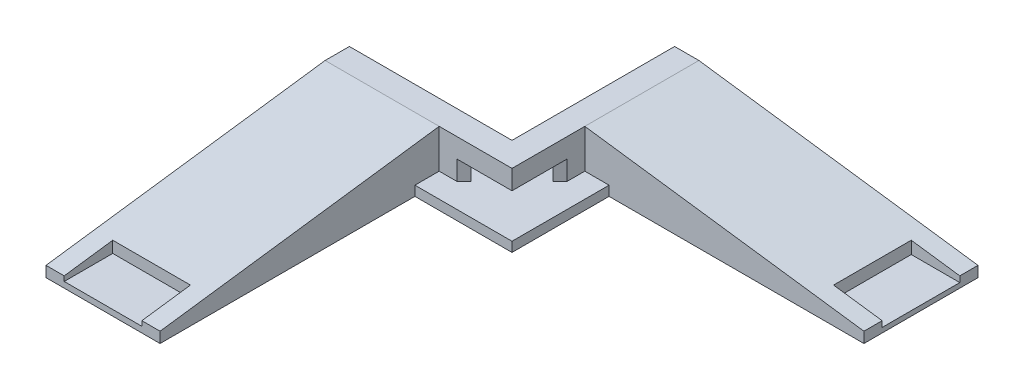
ISO-10303-21;
HEADER;
FILE_DESCRIPTION(('STEP AP214'),'2;1');
FILE_NAME('part.step','',(''),(''),'','','');
FILE_SCHEMA(('AUTOMOTIVE_DESIGN { 1 0 10303 214 1 1 1 1 }'));
ENDSEC;
DATA;
#1=APPLICATION_CONTEXT('core data for automotive mechanical design processes');
#2=APPLICATION_PROTOCOL_DEFINITION('international standard','automotive_design',2000,#1);
#3=PRODUCT_CONTEXT('',#1,'mechanical');
#4=PRODUCT('Part','Part','',(#3));
#5=PRODUCT_RELATED_PRODUCT_CATEGORY('part','',(#4));
#6=PRODUCT_DEFINITION_FORMATION('','',#4);
#7=PRODUCT_DEFINITION_CONTEXT('part definition',#1,'design');
#8=PRODUCT_DEFINITION('design','',#6,#7);
#9=PRODUCT_DEFINITION_SHAPE('','',#8);
#10=(LENGTH_UNIT() NAMED_UNIT(*) SI_UNIT(.MILLI.,.METRE.));
#11=(NAMED_UNIT(*) PLANE_ANGLE_UNIT() SI_UNIT($,.RADIAN.));
#12=(NAMED_UNIT(*) SI_UNIT($,.STERADIAN.) SOLID_ANGLE_UNIT());
#13=UNCERTAINTY_MEASURE_WITH_UNIT(LENGTH_MEASURE(1.E-05),#10,'distance_accuracy_value','');
#14=(GEOMETRIC_REPRESENTATION_CONTEXT(3) GLOBAL_UNCERTAINTY_ASSIGNED_CONTEXT((#13)) GLOBAL_UNIT_ASSIGNED_CONTEXT((#10,
#11,#12)) REPRESENTATION_CONTEXT('',''));
#15=CARTESIAN_POINT('',(0.,0.,0.));
#16=DIRECTION('',(0.,0.,1.));
#17=DIRECTION('',(1.,0.,0.));
#18=AXIS2_PLACEMENT_3D('',#15,#16,#17);
#19=CARTESIAN_POINT('',(61.5,10.,52.0338951909027));
#20=DIRECTION('',(-1.,0.,0.));
#21=DIRECTION('',(0.,0.,1.));
#22=AXIS2_PLACEMENT_3D('',#19,#20,#21);
#23=PLANE('',#22);
#24=DIRECTION('',(0.,0.,1.));
#25=VECTOR('',#24,1.);
#26=CARTESIAN_POINT('',(61.5,6.00000000000001,52.0338951909027));
#27=LINE('',#26,#25);
#28=CARTESIAN_POINT('',(61.5,6.,79.2201866919178));
#29=VERTEX_POINT('',#28);
#30=CARTESIAN_POINT('',(61.5,6.,90.5338951909026));
#31=VERTEX_POINT('',#30);
#32=EDGE_CURVE('E106',#29,#31,#27,.T.);
#33=ORIENTED_EDGE('',*,*,#32,.F.);
#34=DIRECTION('',(0.,-1.,0.));
#35=VECTOR('',#34,1.);
#36=CARTESIAN_POINT('',(61.5,10.,79.2201866919178));
#37=LINE('',#36,#35);
#38=CARTESIAN_POINT('',(61.5,2.,79.2201866919178));
#39=VERTEX_POINT('',#38);
#40=EDGE_CURVE('E288',#29,#39,#37,.T.);
#41=ORIENTED_EDGE('',*,*,#40,.T.);
#42=DIRECTION('',(0.,0.,-1.));
#43=VECTOR('',#42,1.);
#44=CARTESIAN_POINT('',(61.5,2.,52.0338951909027));
#45=LINE('',#44,#43);
#46=CARTESIAN_POINT('',(61.5,2.,75.5338951909026));
#47=VERTEX_POINT('',#46);
#48=EDGE_CURVE('E631',#39,#47,#45,.T.);
#49=ORIENTED_EDGE('',*,*,#48,.T.);
#50=DIRECTION('',(0.,1.,0.));
#51=VECTOR('',#50,1.);
#52=CARTESIAN_POINT('',(61.5,10.,75.5338951909026));
#53=LINE('',#52,#51);
#54=CARTESIAN_POINT('',(61.4999999999999,10.,75.5338951909026));
#55=VERTEX_POINT('',#54);
#56=EDGE_CURVE('E355',#47,#55,#53,.T.);
#57=ORIENTED_EDGE('',*,*,#56,.T.);
#58=DIRECTION('',(0.,0.,-1.));
#59=VECTOR('',#58,1.);
#60=CARTESIAN_POINT('',(61.5,10.,52.0338951909027));
#61=LINE('',#60,#59);
#62=CARTESIAN_POINT('',(61.5,10.,90.5338951909026));
#63=VERTEX_POINT('',#62);
#64=EDGE_CURVE('E543',#63,#55,#61,.T.);
#65=ORIENTED_EDGE('',*,*,#64,.F.);
#66=DIRECTION('',(0.,-1.,0.));
#67=VECTOR('',#66,1.);
#68=CARTESIAN_POINT('',(61.5,10.,90.5338951909026));
#69=LINE('',#68,#67);
#70=EDGE_CURVE('E292',#63,#31,#69,.T.);
#71=ORIENTED_EDGE('',*,*,#70,.T.);
#72=EDGE_LOOP('',(#33,#41,#49,#57,#65,#71));
#73=FACE_BOUND('',#72,.T.);
#74=ADVANCED_FACE('F83',(#73),#23,.F.);
#75=CARTESIAN_POINT('',(61.5,10.,90.5338951909026));
#76=DIRECTION('',(0.,0.,-1.));
#77=DIRECTION('',(-1.,0.,0.));
#78=AXIS2_PLACEMENT_3D('',#75,#76,#77);
#79=PLANE('',#78);
#80=DIRECTION('',(1.,0.,0.));
#81=VECTOR('',#80,1.);
#82=CARTESIAN_POINT('',(61.5,2.,90.5338951909026));
#83=LINE('',#82,#81);
#84=CARTESIAN_POINT('',(46.5,2.,90.5338951909027));
#85=VERTEX_POINT('',#84);
#86=CARTESIAN_POINT('',(50.1862915010151,2.,90.5338951909026));
#87=VERTEX_POINT('',#86);
#88=EDGE_CURVE('E633',#85,#87,#83,.T.);
#89=ORIENTED_EDGE('',*,*,#88,.T.);
#90=DIRECTION('',(0.,1.,0.));
#91=VECTOR('',#90,1.);
#92=CARTESIAN_POINT('',(50.1862915010151,10.,90.5338951909026));
#93=LINE('',#92,#91);
#94=CARTESIAN_POINT('',(50.1862915010151,6.,90.5338951909026));
#95=VERTEX_POINT('',#94);
#96=EDGE_CURVE('E305',#87,#95,#93,.T.);
#97=ORIENTED_EDGE('',*,*,#96,.T.);
#98=DIRECTION('',(-1.,0.,0.));
#99=VECTOR('',#98,1.);
#100=CARTESIAN_POINT('',(61.5,6.,90.5338951909026));
#101=LINE('',#100,#99);
#102=EDGE_CURVE('E295',#31,#95,#101,.T.);
#103=ORIENTED_EDGE('',*,*,#102,.F.);
#104=ORIENTED_EDGE('',*,*,#70,.F.);
#105=DIRECTION('',(1.,0.,0.));
#106=VECTOR('',#105,1.);
#107=CARTESIAN_POINT('',(61.5,10.,90.5338951909026));
#108=LINE('',#107,#106);
#109=CARTESIAN_POINT('',(46.5,10.,90.5338951909027));
#110=VERTEX_POINT('',#109);
#111=EDGE_CURVE('E544',#110,#63,#108,.T.);
#112=ORIENTED_EDGE('',*,*,#111,.F.);
#113=DIRECTION('',(0.,1.,0.));
#114=VECTOR('',#113,1.);
#115=CARTESIAN_POINT('',(46.5,2.,90.5338951909027));
#116=LINE('',#115,#114);
#117=EDGE_CURVE('E743',#85,#110,#116,.T.);
#118=ORIENTED_EDGE('',*,*,#117,.F.);
#119=EDGE_LOOP('',(#89,#97,#103,#104,#112,#118));
#120=FACE_BOUND('',#119,.T.);
#121=ADVANCED_FACE('F495',(#120),#79,.F.);
#122=CARTESIAN_POINT('',(56.5,2.,85.5338951909027));
#123=DIRECTION('',(1.,0.,0.));
#124=DIRECTION('',(0.,0.,-1.));
#125=AXIS2_PLACEMENT_3D('',#122,#123,#124);
#126=PLANE('',#125);
#127=DIRECTION('',(0.,0.,1.));
#128=VECTOR('',#127,1.);
#129=CARTESIAN_POINT('',(56.5,2.,85.5338951909027));
#130=LINE('',#129,#128);
#131=CARTESIAN_POINT('',(56.5,2.,77.048613816664));
#132=VERTEX_POINT('',#131);
#133=CARTESIAN_POINT('',(56.5,2.,85.5338951909027));
#134=VERTEX_POINT('',#133);
#135=EDGE_CURVE('E294',#132,#134,#130,.T.);
#136=ORIENTED_EDGE('',*,*,#135,.F.);
#137=DIRECTION('',(0.,-1.,0.));
#138=VECTOR('',#137,1.);
#139=CARTESIAN_POINT('',(56.5,2.,77.048613816664));
#140=LINE('',#139,#138);
#141=CARTESIAN_POINT('',(56.5,6.,77.048613816664));
#142=VERTEX_POINT('',#141);
#143=EDGE_CURVE('E12',#142,#132,#140,.T.);
#144=ORIENTED_EDGE('',*,*,#143,.F.);
#145=DIRECTION('',(0.,0.,-1.));
#146=VECTOR('',#145,1.);
#147=CARTESIAN_POINT('',(56.5,6.,85.5338951909027));
#148=LINE('',#147,#146);
#149=CARTESIAN_POINT('',(56.5,6.,85.5338951909027));
#150=VERTEX_POINT('',#149);
#151=EDGE_CURVE('E339',#150,#142,#148,.T.);
#152=ORIENTED_EDGE('',*,*,#151,.F.);
#153=DIRECTION('',(0.,-1.,0.));
#154=VECTOR('',#153,1.);
#155=CARTESIAN_POINT('',(56.5,2.,85.5338951909027));
#156=LINE('',#155,#154);
#157=CARTESIAN_POINT('',(56.5,10.,85.5338951909027));
#158=VERTEX_POINT('',#157);
#159=EDGE_CURVE('E658',#158,#150,#156,.T.);
#160=ORIENTED_EDGE('',*,*,#159,.F.);
#161=DIRECTION('',(0.,0.,1.));
#162=VECTOR('',#161,1.);
#163=CARTESIAN_POINT('',(56.5,10.,85.5338951909027));
#164=LINE('',#163,#162);
#165=CARTESIAN_POINT('',(56.5,10.,52.0338951909027));
#166=VERTEX_POINT('',#165);
#167=EDGE_CURVE('E729',#166,#158,#164,.T.);
#168=ORIENTED_EDGE('',*,*,#167,.F.);
#169=DIRECTION('',(0.,-1.,0.));
#170=VECTOR('',#169,1.);
#171=CARTESIAN_POINT('',(56.5,2.,52.0338951909027));
#172=LINE('',#171,#170);
#173=CARTESIAN_POINT('',(56.5,0.,52.0338951909027));
#174=VERTEX_POINT('',#173);
#175=EDGE_CURVE('E654',#166,#174,#172,.T.);
#176=ORIENTED_EDGE('',*,*,#175,.T.);
#177=DIRECTION('',(0.,0.,1.));
#178=VECTOR('',#177,1.);
#179=CARTESIAN_POINT('',(56.5,0.,85.5338951909027));
#180=LINE('',#179,#178);
#181=CARTESIAN_POINT('',(56.5,0.,85.5338951909027));
#182=VERTEX_POINT('',#181);
#183=EDGE_CURVE('E674',#174,#182,#180,.T.);
#184=ORIENTED_EDGE('',*,*,#183,.T.);
#185=EDGE_CURVE('E662',#134,#182,#156,.T.);
#186=ORIENTED_EDGE('',*,*,#185,.F.);
#187=EDGE_LOOP('',(#136,#144,#152,#160,#168,#176,#184,#186));
#188=FACE_BOUND('',#187,.T.);
#189=ADVANCED_FACE('F498',(#188),#126,.F.);
#190=CARTESIAN_POINT('',(23.,2.,85.5338951909027));
#191=DIRECTION('',(0.,0.,1.));
#192=DIRECTION('',(1.,0.,0.));
#193=AXIS2_PLACEMENT_3D('',#190,#191,#192);
#194=PLANE('',#193);
#195=DIRECTION('',(-1.,0.,0.));
#196=VECTOR('',#195,1.);
#197=CARTESIAN_POINT('',(23.,2.,85.5338951909027));
#198=LINE('',#197,#196);
#199=CARTESIAN_POINT('',(48.0147186257615,2.,85.5338951909027));
#200=VERTEX_POINT('',#199);
#201=EDGE_CURVE('E93',#134,#200,#198,.T.);
#202=ORIENTED_EDGE('',*,*,#201,.F.);
#203=ORIENTED_EDGE('',*,*,#185,.T.);
#204=DIRECTION('',(-1.,0.,0.));
#205=VECTOR('',#204,1.);
#206=CARTESIAN_POINT('',(23.,0.,85.5338951909027));
#207=LINE('',#206,#205);
#208=CARTESIAN_POINT('',(23.,0.,85.5338951909027));
#209=VERTEX_POINT('',#208);
#210=EDGE_CURVE('E670',#182,#209,#207,.T.);
#211=ORIENTED_EDGE('',*,*,#210,.T.);
#212=DIRECTION('',(0.,-1.,0.));
#213=VECTOR('',#212,1.);
#214=CARTESIAN_POINT('',(23.,2.,85.5338951909027));
#215=LINE('',#214,#213);
#216=CARTESIAN_POINT('',(23.,10.,85.5338951909027));
#217=VERTEX_POINT('',#216);
#218=EDGE_CURVE('E663',#217,#209,#215,.T.);
#219=ORIENTED_EDGE('',*,*,#218,.F.);
#220=DIRECTION('',(-1.,0.,0.));
#221=VECTOR('',#220,1.);
#222=CARTESIAN_POINT('',(23.,10.,85.5338951909027));
#223=LINE('',#222,#221);
#224=EDGE_CURVE('E731',#158,#217,#223,.T.);
#225=ORIENTED_EDGE('',*,*,#224,.F.);
#226=ORIENTED_EDGE('',*,*,#159,.T.);
#227=DIRECTION('',(1.,0.,0.));
#228=VECTOR('',#227,1.);
#229=CARTESIAN_POINT('',(23.,5.99999999999999,85.5338951909027));
#230=LINE('',#229,#228);
#231=CARTESIAN_POINT('',(48.0147186257614,6.,85.5338951909027));
#232=VERTEX_POINT('',#231);
#233=EDGE_CURVE('E803',#232,#150,#230,.T.);
#234=ORIENTED_EDGE('',*,*,#233,.F.);
#235=DIRECTION('',(0.,1.,0.));
#236=VECTOR('',#235,1.);
#237=CARTESIAN_POINT('',(48.0147186257614,2.00000000000004,85.5338951909027));
#238=LINE('',#237,#236);
#239=EDGE_CURVE('E805',#200,#232,#238,.T.);
#240=ORIENTED_EDGE('',*,*,#239,.F.);
#241=EDGE_LOOP('',(#202,#203,#211,#219,#225,#226,#234,#240));
#242=FACE_BOUND('',#241,.T.);
#243=ADVANCED_FACE('F434',(#242),#194,.F.);
#244=CARTESIAN_POINT('',(119.,0.,52.0338951909027));
#245=DIRECTION('',(-1.,0.,0.));
#246=DIRECTION('',(0.,0.,1.));
#247=AXIS2_PLACEMENT_3D('',#244,#245,#246);
#248=PLANE('',#247);
#249=CARTESIAN_POINT('',(119.,2.2,55.7838951909021));
#250=DIRECTION('',(0.,0.,-1.));
#251=VECTOR('',#250,1.);
#252=LINE('',#249,#251);
#253=CARTESIAN_POINT('',(119.,2.2,55.7838951909021));
#254=VERTEX_POINT('',#253);
#255=CARTESIAN_POINT('',(119.,2.2,52.0338951909021));
#256=VERTEX_POINT('',#255);
#257=EDGE_CURVE('E404',#254,#256,#252,.T.);
#258=ORIENTED_EDGE('',*,*,#257,.F.);
#259=DIRECTION('',(0.,1.,0.));
#260=VECTOR('',#259,1.);
#261=CARTESIAN_POINT('',(119.,1.,55.7838951909027));
#262=LINE('',#261,#260);
#263=CARTESIAN_POINT('',(119.,1.,55.7838951909027));
#264=VERTEX_POINT('',#263);
#265=EDGE_CURVE('E466',#264,#254,#262,.T.);
#266=ORIENTED_EDGE('',*,*,#265,.F.);
#267=DIRECTION('',(0.,0.,1.));
#268=VECTOR('',#267,1.);
#269=CARTESIAN_POINT('',(119.,1.,0.));
#270=LINE('',#269,#268);
#271=CARTESIAN_POINT('',(119.,1.,71.7838951909027));
#272=VERTEX_POINT('',#271);
#273=EDGE_CURVE('E638',#264,#272,#270,.T.);
#274=ORIENTED_EDGE('',*,*,#273,.T.);
#275=DIRECTION('',(0.,1.,0.));
#276=VECTOR('',#275,1.);
#277=CARTESIAN_POINT('',(119.,1.,71.7838951909027));
#278=LINE('',#277,#276);
#279=CARTESIAN_POINT('',(119.,2.2,71.7838951909021));
#280=VERTEX_POINT('',#279);
#281=EDGE_CURVE('E463',#272,#280,#278,.T.);
#282=ORIENTED_EDGE('',*,*,#281,.T.);
#283=CARTESIAN_POINT('',(119.,2.2,75.5338951909021));
#284=DIRECTION('',(0.,0.,-1.));
#285=VECTOR('',#284,1.);
#286=LINE('',#283,#285);
#287=CARTESIAN_POINT('',(119.,2.2,75.5338951909021));
#288=VERTEX_POINT('',#287);
#289=EDGE_CURVE('E848',#288,#280,#286,.T.);
#290=ORIENTED_EDGE('',*,*,#289,.F.);
#291=CARTESIAN_POINT('',(119.,2.,75.5338951909027));
#292=DIRECTION('',(0.,1.,0.));
#293=VECTOR('',#292,1.);
#294=LINE('',#291,#293);
#295=CARTESIAN_POINT('',(119.,2.,75.5338951909021));
#296=VERTEX_POINT('',#295);
#297=EDGE_CURVE('E850',#296,#288,#294,.T.);
#298=ORIENTED_EDGE('',*,*,#297,.F.);
#299=DIRECTION('',(0.,1.,0.));
#300=VECTOR('',#299,1.);
#301=CARTESIAN_POINT('',(119.,0.,75.5338951909027));
#302=LINE('',#301,#300);
#303=CARTESIAN_POINT('',(119.,0.,75.5338951909027));
#304=VERTEX_POINT('',#303);
#305=EDGE_CURVE('E467',#304,#296,#302,.T.);
#306=ORIENTED_EDGE('',*,*,#305,.F.);
#307=DIRECTION('',(0.,0.,1.));
#308=VECTOR('',#307,1.);
#309=CARTESIAN_POINT('',(119.,0.,52.0338951909027));
#310=LINE('',#309,#308);
#311=CARTESIAN_POINT('',(119.,0.,52.0338951909027));
#312=VERTEX_POINT('',#311);
#313=EDGE_CURVE('E602',#312,#304,#310,.T.);
#314=ORIENTED_EDGE('',*,*,#313,.F.);
#315=DIRECTION('',(0.,1.,0.));
#316=VECTOR('',#315,1.);
#317=CARTESIAN_POINT('',(119.,0.,52.0338951909027));
#318=LINE('',#317,#316);
#319=CARTESIAN_POINT('',(119.,2.,52.0338951909021));
#320=VERTEX_POINT('',#319);
#321=EDGE_CURVE('E473',#312,#320,#318,.T.);
#322=ORIENTED_EDGE('',*,*,#321,.T.);
#323=CARTESIAN_POINT('',(119.,2.2,52.0338951909027));
#324=DIRECTION('',(0.,-1.,0.));
#325=VECTOR('',#324,1.);
#326=LINE('',#323,#325);
#327=EDGE_CURVE('E456',#256,#320,#326,.T.);
#328=ORIENTED_EDGE('',*,*,#327,.F.);
#329=EDGE_LOOP('',(#258,#266,#274,#282,#290,#298,#306,#314,#322,#328));
#330=FACE_BOUND('',#329,.T.);
#331=ADVANCED_FACE('F379',(#330),#248,.F.);
#332=CARTESIAN_POINT('',(-26.0660261456996,21.8785218075905,29.0338951909034));
#333=DIRECTION('',(-0.134421036613478,-0.990924308368585,0.));
#334=DIRECTION('',(-0.990924308368585,0.134421036613478,0.));
#335=AXIS2_PLACEMENT_3D('',#332,#333,#334);
#336=PLANE('',#335);
#337=DIRECTION('',(-0.990924308368585,0.134421036613478,0.));
#338=VECTOR('',#337,1.);
#339=CARTESIAN_POINT('',(-26.0660261456993,21.8785218075905,55.7838951909034));
#340=LINE('',#339,#338);
#341=CARTESIAN_POINT('',(109.,3.55652173913043,55.7838951909022));
#342=VERTEX_POINT('',#341);
#343=EDGE_CURVE('E807',#254,#342,#340,.T.);
#344=ORIENTED_EDGE('',*,*,#343,.F.);
#345=ORIENTED_EDGE('',*,*,#257,.T.);
#346=DIRECTION('',(0.990924308368585,-0.134421036613478,0.));
#347=VECTOR('',#346,1.);
#348=CARTESIAN_POINT('',(61.4999999999997,10.,52.0338951909026));
#349=LINE('',#348,#347);
#350=CARTESIAN_POINT('',(61.4999999999997,10.,52.0338951909026));
#351=VERTEX_POINT('',#350);
#352=EDGE_CURVE('E351',#351,#256,#349,.T.);
#353=ORIENTED_EDGE('',*,*,#352,.F.);
#354=CARTESIAN_POINT('',(61.5,10.,75.5338951909026));
#355=DIRECTION('',(0.,0.,-1.));
#356=VECTOR('',#355,1.);
#357=LINE('',#354,#356);
#358=EDGE_CURVE('E346',#55,#351,#357,.T.);
#359=ORIENTED_EDGE('',*,*,#358,.F.);
#360=DIRECTION('',(0.990924308368585,-0.134421036613478,0.));
#361=VECTOR('',#360,1.);
#362=CARTESIAN_POINT('',(61.4999999999999,10.,75.5338951909026));
#363=LINE('',#362,#361);
#364=EDGE_CURVE('E352',#55,#288,#363,.T.);
#365=ORIENTED_EDGE('',*,*,#364,.T.);
#366=ORIENTED_EDGE('',*,*,#289,.T.);
#367=DIRECTION('',(0.990924308368585,-0.134421036613478,0.));
#368=VECTOR('',#367,1.);
#369=CARTESIAN_POINT('',(-26.0660261456992,21.8785218075905,71.7838951909034));
#370=LINE('',#369,#368);
#371=CARTESIAN_POINT('',(109.,3.55652173913043,71.7838951909022));
#372=VERTEX_POINT('',#371);
#373=EDGE_CURVE('E813',#372,#280,#370,.T.);
#374=ORIENTED_EDGE('',*,*,#373,.F.);
#375=DIRECTION('',(0.,0.,1.));
#376=VECTOR('',#375,1.);
#377=CARTESIAN_POINT('',(109.,3.55652173913043,29.0338951909022));
#378=LINE('',#377,#376);
#379=EDGE_CURVE('E414',#342,#372,#378,.T.);
#380=ORIENTED_EDGE('',*,*,#379,.F.);
#381=EDGE_LOOP('',(#344,#345,#353,#359,#365,#366,#374,#380));
#382=FACE_BOUND('',#381,.T.);
#383=ADVANCED_FACE('F368',(#382),#336,.F.);
#384=CARTESIAN_POINT('',(0.,2.,0.));
#385=DIRECTION('',(0.,1.,0.));
#386=DIRECTION('',(0.,0.,1.));
#387=AXIS2_PLACEMENT_3D('',#384,#385,#386);
#388=PLANE('',#387);
#389=ORIENTED_EDGE('',*,*,#48,.F.);
#390=DIRECTION('',(-0.70710678118655,0.,0.707106781186545));
#391=VECTOR('',#390,1.);
#392=CARTESIAN_POINT('',(62.2071067811866,2.,78.5130799107313));
#393=LINE('',#392,#391);
#394=CARTESIAN_POINT('',(60.0857864376269,2.,80.6344002542909));
#395=VERTEX_POINT('',#394);
#396=EDGE_CURVE('E302',#39,#395,#393,.T.);
#397=ORIENTED_EDGE('',*,*,#396,.T.);
#398=DIRECTION('',(-0.707106781186548,0.,-0.707106781186547));
#399=VECTOR('',#398,1.);
#400=CARTESIAN_POINT('',(123.24274068712,2.,143.791354503784));
#401=LINE('',#400,#399);
#402=EDGE_CURVE('E332',#395,#132,#401,.T.);
#403=ORIENTED_EDGE('',*,*,#402,.T.);
#404=ORIENTED_EDGE('',*,*,#135,.T.);
#405=ORIENTED_EDGE('',*,*,#201,.T.);
#406=DIRECTION('',(-0.707106781186548,0.,-0.707106781186547));
#407=VECTOR('',#406,1.);
#408=CARTESIAN_POINT('',(114.757459312881,2.,152.276635878022));
#409=LINE('',#408,#407);
#410=CARTESIAN_POINT('',(51.6005050633883,2.,89.1196816285295));
#411=VERTEX_POINT('',#410);
#412=EDGE_CURVE('E335',#411,#200,#409,.T.);
#413=ORIENTED_EDGE('',*,*,#412,.F.);
#414=EDGE_CURVE('E312',#411,#87,#393,.T.);
#415=ORIENTED_EDGE('',*,*,#414,.T.);
#416=ORIENTED_EDGE('',*,*,#88,.F.);
#417=DIRECTION('',(0.,0.,1.));
#418=VECTOR('',#417,1.);
#419=CARTESIAN_POINT('',(46.5,2.,90.5338951909027));
#420=LINE('',#419,#418);
#421=CARTESIAN_POINT('',(46.5,2.,95.5338951909027));
#422=VERTEX_POINT('',#421);
#423=EDGE_CURVE('E770',#85,#422,#420,.T.);
#424=ORIENTED_EDGE('',*,*,#423,.T.);
#425=DIRECTION('',(1.,0.,0.));
#426=VECTOR('',#425,1.);
#427=CARTESIAN_POINT('',(46.5,2.,95.5338951909027));
#428=LINE('',#427,#426);
#429=CARTESIAN_POINT('',(66.5,2.,95.5338951909027));
#430=VERTEX_POINT('',#429);
#431=EDGE_CURVE('E669',#422,#430,#428,.T.);
#432=ORIENTED_EDGE('',*,*,#431,.T.);
#433=DIRECTION('',(0.,0.,-1.));
#434=VECTOR('',#433,1.);
#435=CARTESIAN_POINT('',(66.5,2.,95.5338951909027));
#436=LINE('',#435,#434);
#437=CARTESIAN_POINT('',(66.5,2.,75.5338951909026));
#438=VERTEX_POINT('',#437);
#439=EDGE_CURVE('E666',#430,#438,#436,.T.);
#440=ORIENTED_EDGE('',*,*,#439,.T.);
#441=DIRECTION('',(1.,0.,0.));
#442=VECTOR('',#441,1.);
#443=CARTESIAN_POINT('',(61.4999999999999,2.,75.5338951909026));
#444=LINE('',#443,#442);
#445=EDGE_CURVE('E347',#47,#438,#444,.T.);
#446=ORIENTED_EDGE('',*,*,#445,.F.);
#447=EDGE_LOOP('',(#389,#397,#403,#404,#405,#413,#415,#416,#424,#432,#440,#446));
#448=FACE_BOUND('',#447,.T.);
#449=ADVANCED_FACE('F378',(#448),#388,.T.);
#450=CARTESIAN_POINT('',(46.5,2.,95.5338951909027));
#451=DIRECTION('',(-1.,0.,0.));
#452=DIRECTION('',(0.,0.,1.));
#453=AXIS2_PLACEMENT_3D('',#450,#451,#452);
#454=PLANE('',#453);
#455=DIRECTION('',(0.,-1.,0.));
#456=VECTOR('',#455,1.);
#457=CARTESIAN_POINT('',(46.5,2.,95.5338951909027));
#458=LINE('',#457,#456);
#459=CARTESIAN_POINT('',(46.5,0.,95.5338951909027));
#460=VERTEX_POINT('',#459);
#461=EDGE_CURVE('E642',#422,#460,#458,.T.);
#462=ORIENTED_EDGE('',*,*,#461,.F.);
#463=ORIENTED_EDGE('',*,*,#423,.F.);
#464=ORIENTED_EDGE('',*,*,#117,.T.);
#465=DIRECTION('',(0.,-0.134421036613478,0.990924308368585));
#466=VECTOR('',#465,1.);
#467=CARTESIAN_POINT('',(46.5,10.,90.5338951909027));
#468=LINE('',#467,#466);
#469=CARTESIAN_POINT('',(46.5,2.2,148.033895190903));
#470=VERTEX_POINT('',#469);
#471=EDGE_CURVE('E747',#110,#470,#468,.T.);
#472=ORIENTED_EDGE('',*,*,#471,.T.);
#473=DIRECTION('',(0.,1.,0.));
#474=VECTOR('',#473,1.);
#475=CARTESIAN_POINT('',(46.5,2.2,148.033895190903));
#476=LINE('',#475,#474);
#477=CARTESIAN_POINT('',(46.5,2.,148.033895190903));
#478=VERTEX_POINT('',#477);
#479=EDGE_CURVE('E529',#478,#470,#476,.T.);
#480=ORIENTED_EDGE('',*,*,#479,.F.);
#481=DIRECTION('',(0.,1.,0.));
#482=VECTOR('',#481,1.);
#483=CARTESIAN_POINT('',(46.5,0.,148.033895190903));
#484=LINE('',#483,#482);
#485=CARTESIAN_POINT('',(46.5,0.,148.033895190903));
#486=VERTEX_POINT('',#485);
#487=EDGE_CURVE('E587',#486,#478,#484,.T.);
#488=ORIENTED_EDGE('',*,*,#487,.F.);
#489=DIRECTION('',(0.,0.,-1.));
#490=VECTOR('',#489,1.);
#491=CARTESIAN_POINT('',(46.5,0.,95.5338951909027));
#492=LINE('',#491,#490);
#493=EDGE_CURVE('E691',#486,#460,#492,.T.);
#494=ORIENTED_EDGE('',*,*,#493,.T.);
#495=EDGE_LOOP('',(#462,#463,#464,#472,#480,#488,#494));
#496=FACE_BOUND('',#495,.T.);
#497=ADVANCED_FACE('F85',(#496),#454,.F.);
#498=CARTESIAN_POINT('',(46.5,2.,95.5338951909027));
#499=DIRECTION('',(0.,0.,-1.));
#500=DIRECTION('',(-1.,0.,0.));
#501=AXIS2_PLACEMENT_3D('',#498,#499,#500);
#502=PLANE('',#501);
#503=DIRECTION('',(1.,0.,0.));
#504=VECTOR('',#503,1.);
#505=CARTESIAN_POINT('',(46.5,0.,95.5338951909027));
#506=LINE('',#505,#504);
#507=CARTESIAN_POINT('',(66.5,0.,95.5338951909027));
#508=VERTEX_POINT('',#507);
#509=EDGE_CURVE('E688',#460,#508,#506,.T.);
#510=ORIENTED_EDGE('',*,*,#509,.T.);
#511=DIRECTION('',(0.,-1.,0.));
#512=VECTOR('',#511,1.);
#513=CARTESIAN_POINT('',(66.5,2.,95.5338951909027));
#514=LINE('',#513,#512);
#515=EDGE_CURVE('E646',#430,#508,#514,.T.);
#516=ORIENTED_EDGE('',*,*,#515,.F.);
#517=ORIENTED_EDGE('',*,*,#431,.F.);
#518=ORIENTED_EDGE('',*,*,#461,.T.);
#519=EDGE_LOOP('',(#510,#516,#517,#518));
#520=FACE_BOUND('',#519,.T.);
#521=ADVANCED_FACE('F793',(#520),#502,.F.);
#522=CARTESIAN_POINT('',(66.5,2.,95.5338951909027));
#523=DIRECTION('',(-1.,0.,0.));
#524=DIRECTION('',(0.,0.,1.));
#525=AXIS2_PLACEMENT_3D('',#522,#523,#524);
#526=PLANE('',#525);
#527=DIRECTION('',(0.,0.,-1.));
#528=VECTOR('',#527,1.);
#529=CARTESIAN_POINT('',(66.5,0.,95.5338951909027));
#530=LINE('',#529,#528);
#531=CARTESIAN_POINT('',(66.5,0.,75.5338951909027));
#532=VERTEX_POINT('',#531);
#533=EDGE_CURVE('E685',#508,#532,#530,.T.);
#534=ORIENTED_EDGE('',*,*,#533,.T.);
#535=DIRECTION('',(0.,-1.,0.));
#536=VECTOR('',#535,1.);
#537=CARTESIAN_POINT('',(66.5,2.,75.5338951909027));
#538=LINE('',#537,#536);
#539=EDGE_CURVE('E650',#438,#532,#538,.T.);
#540=ORIENTED_EDGE('',*,*,#539,.F.);
#541=ORIENTED_EDGE('',*,*,#439,.F.);
#542=ORIENTED_EDGE('',*,*,#515,.T.);
#543=EDGE_LOOP('',(#534,#540,#541,#542));
#544=FACE_BOUND('',#543,.T.);
#545=ADVANCED_FACE('F947',(#544),#526,.F.);
#546=CARTESIAN_POINT('',(66.5,2.,75.5338951909027));
#547=DIRECTION('',(0.,0.,-1.));
#548=DIRECTION('',(-1.,0.,0.));
#549=AXIS2_PLACEMENT_3D('',#546,#547,#548);
#550=PLANE('',#549);
#551=DIRECTION('',(1.,0.,0.));
#552=VECTOR('',#551,1.);
#553=CARTESIAN_POINT('',(66.5,0.,75.5338951909027));
#554=LINE('',#553,#552);
#555=EDGE_CURVE('E681',#532,#304,#554,.T.);
#556=ORIENTED_EDGE('',*,*,#555,.T.);
#557=ORIENTED_EDGE('',*,*,#305,.T.);
#558=ORIENTED_EDGE('',*,*,#297,.T.);
#559=ORIENTED_EDGE('',*,*,#364,.F.);
#560=ORIENTED_EDGE('',*,*,#56,.F.);
#561=ORIENTED_EDGE('',*,*,#445,.T.);
#562=ORIENTED_EDGE('',*,*,#539,.T.);
#563=EDGE_LOOP('',(#556,#557,#558,#559,#560,#561,#562));
#564=FACE_BOUND('',#563,.T.);
#565=ADVANCED_FACE('F943',(#564),#550,.F.);
#566=CARTESIAN_POINT('',(66.5,2.,52.0338951909027));
#567=DIRECTION('',(0.,0.,1.));
#568=DIRECTION('',(1.,0.,0.));
#569=AXIS2_PLACEMENT_3D('',#566,#567,#568);
#570=PLANE('',#569);
#571=ORIENTED_EDGE('',*,*,#327,.T.);
#572=ORIENTED_EDGE('',*,*,#321,.F.);
#573=DIRECTION('',(-1.,0.,0.));
#574=VECTOR('',#573,1.);
#575=CARTESIAN_POINT('',(66.5,0.,52.0338951909027));
#576=LINE('',#575,#574);
#577=EDGE_CURVE('E678',#312,#174,#576,.T.);
#578=ORIENTED_EDGE('',*,*,#577,.T.);
#579=ORIENTED_EDGE('',*,*,#175,.F.);
#580=DIRECTION('',(-1.,0.,0.));
#581=VECTOR('',#580,1.);
#582=CARTESIAN_POINT('',(56.5,10.,52.0338951909027));
#583=LINE('',#582,#581);
#584=EDGE_CURVE('E623',#351,#166,#583,.T.);
#585=ORIENTED_EDGE('',*,*,#584,.F.);
#586=ORIENTED_EDGE('',*,*,#352,.T.);
#587=EDGE_LOOP('',(#571,#572,#578,#579,#585,#586));
#588=FACE_BOUND('',#587,.T.);
#589=ADVANCED_FACE('F510',(#588),#570,.F.);
#590=CARTESIAN_POINT('',(23.,2.,95.5338951909027));
#591=DIRECTION('',(1.,0.,0.));
#592=DIRECTION('',(0.,0.,-1.));
#593=AXIS2_PLACEMENT_3D('',#590,#591,#592);
#594=PLANE('',#593);
#595=DIRECTION('',(0.,1.,0.));
#596=VECTOR('',#595,1.);
#597=CARTESIAN_POINT('',(23.,0.,148.033895190903));
#598=LINE('',#597,#596);
#599=CARTESIAN_POINT('',(23.,0.,148.033895190903));
#600=VERTEX_POINT('',#599);
#601=CARTESIAN_POINT('',(23.,2.,148.033895190903));
#602=VERTEX_POINT('',#601);
#603=EDGE_CURVE('E575',#600,#602,#598,.T.);
#604=ORIENTED_EDGE('',*,*,#603,.T.);
#605=DIRECTION('',(0.,-1.,0.));
#606=VECTOR('',#605,1.);
#607=CARTESIAN_POINT('',(23.,2.,148.033895190903));
#608=LINE('',#607,#606);
#609=CARTESIAN_POINT('',(23.,2.2,148.033895190903));
#610=VERTEX_POINT('',#609);
#611=EDGE_CURVE('E565',#610,#602,#608,.T.);
#612=ORIENTED_EDGE('',*,*,#611,.F.);
#613=DIRECTION('',(0.,-0.134421036613478,0.990924308368585));
#614=VECTOR('',#613,1.);
#615=CARTESIAN_POINT('',(23.,10.,90.5338951909027));
#616=LINE('',#615,#614);
#617=CARTESIAN_POINT('',(23.,10.,90.5338951909027));
#618=VERTEX_POINT('',#617);
#619=EDGE_CURVE('E580',#618,#610,#616,.T.);
#620=ORIENTED_EDGE('',*,*,#619,.F.);
#621=DIRECTION('',(0.,0.,1.));
#622=VECTOR('',#621,1.);
#623=CARTESIAN_POINT('',(23.,10.,90.5338951909027));
#624=LINE('',#623,#622);
#625=EDGE_CURVE('E734',#217,#618,#624,.T.);
#626=ORIENTED_EDGE('',*,*,#625,.F.);
#627=ORIENTED_EDGE('',*,*,#218,.T.);
#628=DIRECTION('',(0.,0.,1.));
#629=VECTOR('',#628,1.);
#630=CARTESIAN_POINT('',(23.,0.,95.5338951909027));
#631=LINE('',#630,#629);
#632=EDGE_CURVE('E584',#209,#600,#631,.T.);
#633=ORIENTED_EDGE('',*,*,#632,.T.);
#634=EDGE_LOOP('',(#604,#612,#620,#626,#627,#633));
#635=FACE_BOUND('',#634,.T.);
#636=ADVANCED_FACE('F505',(#635),#594,.F.);
#637=CARTESIAN_POINT('',(0.,0.,0.));
#638=DIRECTION('',(0.,1.,0.));
#639=DIRECTION('',(0.,0.,1.));
#640=AXIS2_PLACEMENT_3D('',#637,#638,#639);
#641=PLANE('',#640);
#642=ORIENTED_EDGE('',*,*,#577,.F.);
#643=ORIENTED_EDGE('',*,*,#313,.T.);
#644=ORIENTED_EDGE('',*,*,#555,.F.);
#645=ORIENTED_EDGE('',*,*,#533,.F.);
#646=ORIENTED_EDGE('',*,*,#509,.F.);
#647=ORIENTED_EDGE('',*,*,#493,.F.);
#648=DIRECTION('',(-1.,0.,0.));
#649=VECTOR('',#648,1.);
#650=CARTESIAN_POINT('',(23.,0.,148.033895190903));
#651=LINE('',#650,#649);
#652=EDGE_CURVE('E593',#486,#600,#651,.T.);
#653=ORIENTED_EDGE('',*,*,#652,.T.);
#654=ORIENTED_EDGE('',*,*,#632,.F.);
#655=ORIENTED_EDGE('',*,*,#210,.F.);
#656=ORIENTED_EDGE('',*,*,#183,.F.);
#657=EDGE_LOOP('',(#642,#643,#644,#645,#646,#647,#653,#654,#655,#656));
#658=FACE_BOUND('',#657,.T.);
#659=ADVANCED_FACE('F490',(#658),#641,.F.);
#660=CARTESIAN_POINT('',(0.,10.,0.));
#661=DIRECTION('',(0.,-1.,0.));
#662=DIRECTION('',(0.,0.,-1.));
#663=AXIS2_PLACEMENT_3D('',#660,#661,#662);
#664=PLANE('',#663);
#665=ORIENTED_EDGE('',*,*,#167,.T.);
#666=ORIENTED_EDGE('',*,*,#224,.T.);
#667=ORIENTED_EDGE('',*,*,#625,.T.);
#668=DIRECTION('',(1.,0.,0.));
#669=VECTOR('',#668,1.);
#670=CARTESIAN_POINT('',(0.,10.,90.5338951909027));
#671=LINE('',#670,#669);
#672=EDGE_CURVE('E534',#618,#110,#671,.T.);
#673=ORIENTED_EDGE('',*,*,#672,.T.);
#674=ORIENTED_EDGE('',*,*,#111,.T.);
#675=ORIENTED_EDGE('',*,*,#64,.T.);
#676=ORIENTED_EDGE('',*,*,#358,.T.);
#677=ORIENTED_EDGE('',*,*,#584,.T.);
#678=EDGE_LOOP('',(#665,#666,#667,#673,#674,#675,#676,#677));
#679=FACE_BOUND('',#678,.T.);
#680=ADVANCED_FACE('F479',(#679),#664,.F.);
#681=CARTESIAN_POINT('',(129.,1.,55.7838951909027));
#682=DIRECTION('',(0.,0.,-1.));
#683=DIRECTION('',(-1.,0.,0.));
#684=AXIS2_PLACEMENT_3D('',#681,#682,#683);
#685=PLANE('',#684);
#686=ORIENTED_EDGE('',*,*,#343,.T.);
#687=DIRECTION('',(0.,1.,0.));
#688=VECTOR('',#687,1.);
#689=CARTESIAN_POINT('',(109.,1.,55.7838951909027));
#690=LINE('',#689,#688);
#691=CARTESIAN_POINT('',(109.,1.,55.7838951909027));
#692=VERTEX_POINT('',#691);
#693=EDGE_CURVE('E724',#692,#342,#690,.T.);
#694=ORIENTED_EDGE('',*,*,#693,.F.);
#695=DIRECTION('',(-1.,0.,0.));
#696=VECTOR('',#695,1.);
#697=CARTESIAN_POINT('',(129.,1.,55.7838951909027));
#698=LINE('',#697,#696);
#699=EDGE_CURVE('E586',#264,#692,#698,.T.);
#700=ORIENTED_EDGE('',*,*,#699,.F.);
#701=ORIENTED_EDGE('',*,*,#265,.T.);
#702=EDGE_LOOP('',(#686,#694,#700,#701));
#703=FACE_BOUND('',#702,.T.);
#704=ADVANCED_FACE('F489',(#703),#685,.F.);
#705=CARTESIAN_POINT('',(129.,1.,71.7838951909027));
#706=DIRECTION('',(0.,0.,-1.));
#707=DIRECTION('',(-1.,0.,0.));
#708=AXIS2_PLACEMENT_3D('',#705,#706,#707);
#709=PLANE('',#708);
#710=ORIENTED_EDGE('',*,*,#373,.T.);
#711=ORIENTED_EDGE('',*,*,#281,.F.);
#712=DIRECTION('',(-1.,0.,0.));
#713=VECTOR('',#712,1.);
#714=CARTESIAN_POINT('',(129.,1.,71.7838951909027));
#715=LINE('',#714,#713);
#716=CARTESIAN_POINT('',(109.,1.,71.7838951909027));
#717=VERTEX_POINT('',#716);
#718=EDGE_CURVE('E721',#272,#717,#715,.T.);
#719=ORIENTED_EDGE('',*,*,#718,.T.);
#720=DIRECTION('',(0.,1.,0.));
#721=VECTOR('',#720,1.);
#722=CARTESIAN_POINT('',(109.,1.,71.7838951909027));
#723=LINE('',#722,#721);
#724=EDGE_CURVE('E637',#717,#372,#723,.T.);
#725=ORIENTED_EDGE('',*,*,#724,.T.);
#726=EDGE_LOOP('',(#710,#711,#719,#725));
#727=FACE_BOUND('',#726,.T.);
#728=ADVANCED_FACE('F921',(#727),#709,.T.);
#729=CARTESIAN_POINT('',(109.,1.,55.7838951909027));
#730=DIRECTION('',(-1.,0.,0.));
#731=DIRECTION('',(0.,0.,1.));
#732=AXIS2_PLACEMENT_3D('',#729,#730,#731);
#733=PLANE('',#732);
#734=ORIENTED_EDGE('',*,*,#379,.T.);
#735=ORIENTED_EDGE('',*,*,#724,.F.);
#736=DIRECTION('',(0.,0.,1.));
#737=VECTOR('',#736,1.);
#738=CARTESIAN_POINT('',(109.,1.,55.7838951909027));
#739=LINE('',#738,#737);
#740=EDGE_CURVE('E591',#692,#717,#739,.T.);
#741=ORIENTED_EDGE('',*,*,#740,.F.);
#742=ORIENTED_EDGE('',*,*,#693,.T.);
#743=EDGE_LOOP('',(#734,#735,#741,#742));
#744=FACE_BOUND('',#743,.T.);
#745=ADVANCED_FACE('F916',(#744),#733,.F.);
#746=CARTESIAN_POINT('',(0.,1.,0.));
#747=DIRECTION('',(0.,1.,0.));
#748=DIRECTION('',(0.,0.,1.));
#749=AXIS2_PLACEMENT_3D('',#746,#747,#748);
#750=PLANE('',#749);
#751=ORIENTED_EDGE('',*,*,#273,.F.);
#752=ORIENTED_EDGE('',*,*,#699,.T.);
#753=ORIENTED_EDGE('',*,*,#740,.T.);
#754=ORIENTED_EDGE('',*,*,#718,.F.);
#755=EDGE_LOOP('',(#751,#752,#753,#754));
#756=FACE_BOUND('',#755,.T.);
#757=ADVANCED_FACE('F912',(#756),#750,.T.);
#758=CARTESIAN_POINT('',(23.,0.,148.033895190903));
#759=DIRECTION('',(0.,0.,-1.));
#760=DIRECTION('',(-1.,0.,0.));
#761=AXIS2_PLACEMENT_3D('',#758,#759,#760);
#762=PLANE('',#761);
#763=DIRECTION('',(1.,0.,0.));
#764=VECTOR('',#763,1.);
#765=CARTESIAN_POINT('',(26.75,1.2,148.033895190903));
#766=LINE('',#765,#764);
#767=CARTESIAN_POINT('',(26.75,1.2,148.033895190903));
#768=VERTEX_POINT('',#767);
#769=CARTESIAN_POINT('',(42.75,1.2,148.033895190903));
#770=VERTEX_POINT('',#769);
#771=EDGE_CURVE('E855',#768,#770,#766,.T.);
#772=ORIENTED_EDGE('',*,*,#771,.F.);
#773=DIRECTION('',(0.,-1.,0.));
#774=VECTOR('',#773,1.);
#775=CARTESIAN_POINT('',(26.75,5.2,148.033895190903));
#776=LINE('',#775,#774);
#777=CARTESIAN_POINT('',(26.75,2.2,148.033895190903));
#778=VERTEX_POINT('',#777);
#779=EDGE_CURVE('E853',#778,#768,#776,.T.);
#780=ORIENTED_EDGE('',*,*,#779,.F.);
#781=DIRECTION('',(-1.,0.,0.));
#782=VECTOR('',#781,1.);
#783=CARTESIAN_POINT('',(23.,2.2,148.033895190903));
#784=LINE('',#783,#782);
#785=EDGE_CURVE('E550',#778,#610,#784,.T.);
#786=ORIENTED_EDGE('',*,*,#785,.T.);
#787=ORIENTED_EDGE('',*,*,#611,.T.);
#788=ORIENTED_EDGE('',*,*,#603,.F.);
#789=ORIENTED_EDGE('',*,*,#652,.F.);
#790=ORIENTED_EDGE('',*,*,#487,.T.);
#791=ORIENTED_EDGE('',*,*,#479,.T.);
#792=CARTESIAN_POINT('',(42.75,2.2,148.033895190903));
#793=VERTEX_POINT('',#792);
#794=EDGE_CURVE('E603',#470,#793,#784,.T.);
#795=ORIENTED_EDGE('',*,*,#794,.T.);
#796=DIRECTION('',(0.,1.,0.));
#797=VECTOR('',#796,1.);
#798=CARTESIAN_POINT('',(42.75,5.2,148.033895190903));
#799=LINE('',#798,#797);
#800=EDGE_CURVE('E859',#770,#793,#799,.T.);
#801=ORIENTED_EDGE('',*,*,#800,.F.);
#802=EDGE_LOOP('',(#772,#780,#786,#787,#788,#789,#790,#791,#795,#801));
#803=FACE_BOUND('',#802,.T.);
#804=ADVANCED_FACE('F438',(#803),#762,.F.);
#805=CARTESIAN_POINT('',(0.,21.8785218075905,2.96786904520358));
#806=DIRECTION('',(0.,-0.990924308368585,-0.134421036613478));
#807=DIRECTION('',(0.,0.134421036613478,-0.990924308368585));
#808=AXIS2_PLACEMENT_3D('',#805,#806,#807);
#809=PLANE('',#808);
#810=ORIENTED_EDGE('',*,*,#785,.F.);
#811=DIRECTION('',(0.,0.134421036613478,-0.990924308368585));
#812=VECTOR('',#811,1.);
#813=CARTESIAN_POINT('',(26.75,21.8785218075905,2.96786904520358));
#814=LINE('',#813,#812);
#815=CARTESIAN_POINT('',(26.75,3.55652173913043,138.033895190903));
#816=VERTEX_POINT('',#815);
#817=EDGE_CURVE('E887',#778,#816,#814,.T.);
#818=ORIENTED_EDGE('',*,*,#817,.T.);
#819=DIRECTION('',(-1.,0.,0.));
#820=VECTOR('',#819,1.);
#821=CARTESIAN_POINT('',(0.,3.55652173913043,138.033895190903));
#822=LINE('',#821,#820);
#823=CARTESIAN_POINT('',(42.75,3.55652173913043,138.033895190903));
#824=VERTEX_POINT('',#823);
#825=EDGE_CURVE('E641',#824,#816,#822,.T.);
#826=ORIENTED_EDGE('',*,*,#825,.F.);
#827=DIRECTION('',(0.,-0.134421036613478,0.990924308368585));
#828=VECTOR('',#827,1.);
#829=CARTESIAN_POINT('',(42.75,21.8785218075905,2.96786904520358));
#830=LINE('',#829,#828);
#831=EDGE_CURVE('E764',#824,#793,#830,.T.);
#832=ORIENTED_EDGE('',*,*,#831,.T.);
#833=ORIENTED_EDGE('',*,*,#794,.F.);
#834=ORIENTED_EDGE('',*,*,#471,.F.);
#835=ORIENTED_EDGE('',*,*,#672,.F.);
#836=ORIENTED_EDGE('',*,*,#619,.T.);
#837=EDGE_LOOP('',(#810,#818,#826,#832,#833,#834,#835,#836));
#838=FACE_BOUND('',#837,.T.);
#839=ADVANCED_FACE('F435',(#838),#809,.F.);
#840=CARTESIAN_POINT('',(26.75,5.2,138.033895190903));
#841=DIRECTION('',(-1.,0.,0.));
#842=DIRECTION('',(0.,0.,1.));
#843=AXIS2_PLACEMENT_3D('',#840,#841,#842);
#844=PLANE('',#843);
#845=ORIENTED_EDGE('',*,*,#779,.T.);
#846=DIRECTION('',(0.,0.,1.));
#847=VECTOR('',#846,1.);
#848=CARTESIAN_POINT('',(26.75,1.2,138.033895190903));
#849=LINE('',#848,#847);
#850=CARTESIAN_POINT('',(26.75,1.2,138.033895190903));
#851=VERTEX_POINT('',#850);
#852=EDGE_CURVE('E869',#851,#768,#849,.T.);
#853=ORIENTED_EDGE('',*,*,#852,.F.);
#854=DIRECTION('',(0.,-1.,0.));
#855=VECTOR('',#854,1.);
#856=CARTESIAN_POINT('',(26.75,5.2,138.033895190903));
#857=LINE('',#856,#855);
#858=EDGE_CURVE('E391',#816,#851,#857,.T.);
#859=ORIENTED_EDGE('',*,*,#858,.F.);
#860=ORIENTED_EDGE('',*,*,#817,.F.);
#861=EDGE_LOOP('',(#845,#853,#859,#860));
#862=FACE_BOUND('',#861,.T.);
#863=ADVANCED_FACE('F885',(#862),#844,.F.);
#864=CARTESIAN_POINT('',(42.75,5.2,138.033895190903));
#865=DIRECTION('',(1.,0.,0.));
#866=DIRECTION('',(0.,0.,-1.));
#867=AXIS2_PLACEMENT_3D('',#864,#865,#866);
#868=PLANE('',#867);
#869=DIRECTION('',(0.,1.,0.));
#870=VECTOR('',#869,1.);
#871=CARTESIAN_POINT('',(42.75,5.2,138.033895190903));
#872=LINE('',#871,#870);
#873=CARTESIAN_POINT('',(42.75,1.2,138.033895190903));
#874=VERTEX_POINT('',#873);
#875=EDGE_CURVE('E867',#874,#824,#872,.T.);
#876=ORIENTED_EDGE('',*,*,#875,.F.);
#877=DIRECTION('',(0.,0.,1.));
#878=VECTOR('',#877,1.);
#879=CARTESIAN_POINT('',(42.75,1.2,138.033895190903));
#880=LINE('',#879,#878);
#881=EDGE_CURVE('E748',#874,#770,#880,.T.);
#882=ORIENTED_EDGE('',*,*,#881,.T.);
#883=ORIENTED_EDGE('',*,*,#800,.T.);
#884=ORIENTED_EDGE('',*,*,#831,.F.);
#885=EDGE_LOOP('',(#876,#882,#883,#884));
#886=FACE_BOUND('',#885,.T.);
#887=ADVANCED_FACE('F881',(#886),#868,.F.);
#888=CARTESIAN_POINT('',(0.,0.,138.033895190903));
#889=DIRECTION('',(0.,0.,1.));
#890=DIRECTION('',(1.,0.,0.));
#891=AXIS2_PLACEMENT_3D('',#888,#889,#890);
#892=PLANE('',#891);
#893=ORIENTED_EDGE('',*,*,#825,.T.);
#894=ORIENTED_EDGE('',*,*,#858,.T.);
#895=DIRECTION('',(1.,0.,0.));
#896=VECTOR('',#895,1.);
#897=CARTESIAN_POINT('',(26.75,1.2,138.033895190903));
#898=LINE('',#897,#896);
#899=EDGE_CURVE('E864',#851,#874,#898,.T.);
#900=ORIENTED_EDGE('',*,*,#899,.T.);
#901=ORIENTED_EDGE('',*,*,#875,.T.);
#902=EDGE_LOOP('',(#893,#894,#900,#901));
#903=FACE_BOUND('',#902,.T.);
#904=ADVANCED_FACE('F382',(#903),#892,.T.);
#905=CARTESIAN_POINT('',(26.75,1.2,138.033895190903));
#906=DIRECTION('',(0.,-1.,0.));
#907=DIRECTION('',(0.,0.,-1.));
#908=AXIS2_PLACEMENT_3D('',#905,#906,#907);
#909=PLANE('',#908);
#910=ORIENTED_EDGE('',*,*,#771,.T.);
#911=ORIENTED_EDGE('',*,*,#881,.F.);
#912=ORIENTED_EDGE('',*,*,#899,.F.);
#913=ORIENTED_EDGE('',*,*,#852,.T.);
#914=EDGE_LOOP('',(#910,#911,#912,#913));
#915=FACE_BOUND('',#914,.T.);
#916=ADVANCED_FACE('F833',(#915),#909,.F.);
#917=CARTESIAN_POINT('',(123.24274068712,6.,143.791354503784));
#918=DIRECTION('',(-0.707106781186547,0.,0.707106781186548));
#919=DIRECTION('',(0.707106781186548,0.,0.707106781186547));
#920=AXIS2_PLACEMENT_3D('',#917,#918,#919);
#921=PLANE('',#920);
#922=DIRECTION('',(0.,-1.,0.));
#923=VECTOR('',#922,1.);
#924=CARTESIAN_POINT('',(60.0857864376269,6.,80.6344002542909));
#925=LINE('',#924,#923);
#926=CARTESIAN_POINT('',(60.0857864376269,6.,80.6344002542909));
#927=VERTEX_POINT('',#926);
#928=EDGE_CURVE('E322',#927,#395,#925,.T.);
#929=ORIENTED_EDGE('',*,*,#928,.F.);
#930=DIRECTION('',(-0.707106781186548,0.,-0.707106781186547));
#931=VECTOR('',#930,1.);
#932=CARTESIAN_POINT('',(123.24274068712,6.,143.791354503784));
#933=LINE('',#932,#931);
#934=EDGE_CURVE('E310',#927,#142,#933,.T.);
#935=ORIENTED_EDGE('',*,*,#934,.T.);
#936=ORIENTED_EDGE('',*,*,#143,.T.);
#937=ORIENTED_EDGE('',*,*,#402,.F.);
#938=EDGE_LOOP('',(#929,#935,#936,#937));
#939=FACE_BOUND('',#938,.T.);
#940=ADVANCED_FACE('F831',(#939),#921,.T.);
#941=CARTESIAN_POINT('',(114.757459312881,6.,152.276635878022));
#942=DIRECTION('',(0.707106781186547,0.,-0.707106781186548));
#943=DIRECTION('',(-0.707106781186548,0.,-0.707106781186547));
#944=AXIS2_PLACEMENT_3D('',#941,#942,#943);
#945=PLANE('',#944);
#946=DIRECTION('',(0.,1.,0.));
#947=VECTOR('',#946,1.);
#948=CARTESIAN_POINT('',(51.6005050633883,6.,89.1196816285295));
#949=LINE('',#948,#947);
#950=CARTESIAN_POINT('',(51.6005050633883,6.,89.1196816285295));
#951=VERTEX_POINT('',#950);
#952=EDGE_CURVE('E319',#411,#951,#949,.T.);
#953=ORIENTED_EDGE('',*,*,#952,.F.);
#954=ORIENTED_EDGE('',*,*,#412,.T.);
#955=ORIENTED_EDGE('',*,*,#239,.T.);
#956=DIRECTION('',(-0.707106781186548,0.,-0.707106781186547));
#957=VECTOR('',#956,1.);
#958=CARTESIAN_POINT('',(114.757459312881,6.,152.276635878022));
#959=LINE('',#958,#957);
#960=EDGE_CURVE('E304',#951,#232,#959,.T.);
#961=ORIENTED_EDGE('',*,*,#960,.F.);
#962=EDGE_LOOP('',(#953,#954,#955,#961));
#963=FACE_BOUND('',#962,.T.);
#964=ADVANCED_FACE('F380',(#963),#945,.T.);
#965=CARTESIAN_POINT('',(114.757459312881,6.,152.276635878022));
#966=DIRECTION('',(0.,-1.,0.));
#967=DIRECTION('',(0.,0.,-1.));
#968=AXIS2_PLACEMENT_3D('',#965,#966,#967);
#969=PLANE('',#968);
#970=ORIENTED_EDGE('',*,*,#934,.F.);
#971=DIRECTION('',(-0.70710678118655,0.,0.707106781186545));
#972=VECTOR('',#971,1.);
#973=CARTESIAN_POINT('',(62.2071067811866,6.,78.5130799107313));
#974=LINE('',#973,#972);
#975=EDGE_CURVE('E299',#29,#927,#974,.T.);
#976=ORIENTED_EDGE('',*,*,#975,.F.);
#977=ORIENTED_EDGE('',*,*,#32,.T.);
#978=ORIENTED_EDGE('',*,*,#102,.T.);
#979=EDGE_CURVE('E100',#951,#95,#974,.T.);
#980=ORIENTED_EDGE('',*,*,#979,.F.);
#981=ORIENTED_EDGE('',*,*,#960,.T.);
#982=ORIENTED_EDGE('',*,*,#233,.T.);
#983=ORIENTED_EDGE('',*,*,#151,.T.);
#984=EDGE_LOOP('',(#970,#976,#977,#978,#980,#981,#982,#983));
#985=FACE_BOUND('',#984,.T.);
#986=ADVANCED_FACE('F308',(#985),#969,.T.);
#987=CARTESIAN_POINT('',(62.2071067811866,6.,78.5130799107313));
#988=DIRECTION('',(-0.707106781186545,0.,-0.70710678118655));
#989=DIRECTION('',(-0.70710678118655,0.,0.707106781186545));
#990=AXIS2_PLACEMENT_3D('',#987,#988,#989);
#991=PLANE('',#990);
#992=ORIENTED_EDGE('',*,*,#414,.F.);
#993=ORIENTED_EDGE('',*,*,#952,.T.);
#994=ORIENTED_EDGE('',*,*,#979,.T.);
#995=ORIENTED_EDGE('',*,*,#96,.F.);
#996=EDGE_LOOP('',(#992,#993,#994,#995));
#997=FACE_BOUND('',#996,.T.);
#998=ADVANCED_FACE('F823',(#997),#991,.F.);
#999=ORIENTED_EDGE('',*,*,#975,.T.);
#1000=ORIENTED_EDGE('',*,*,#928,.T.);
#1001=ORIENTED_EDGE('',*,*,#396,.F.);
#1002=ORIENTED_EDGE('',*,*,#40,.F.);
#1003=EDGE_LOOP('',(#999,#1000,#1001,#1002));
#1004=FACE_BOUND('',#1003,.T.);
#1005=ADVANCED_FACE('F298',(#1004),#991,.F.);
#1006=CLOSED_SHELL('',(#74,#121,#189,#243,#331,#383,#449,#497,#521,#545,#565,#589,#636,#659,
#680,#704,#728,#745,#757,#804,#839,#863,#887,#904,#916,#940,#964,#986,#998,#1005));
#1007=MANIFOLD_SOLID_BREP('B2',#1006);
#1008=ADVANCED_BREP_SHAPE_REPRESENTATION('',(#18,#1007),#14);
#1009=SHAPE_DEFINITION_REPRESENTATION(#9,#1008);
ENDSEC;
END-ISO-10303-21;
